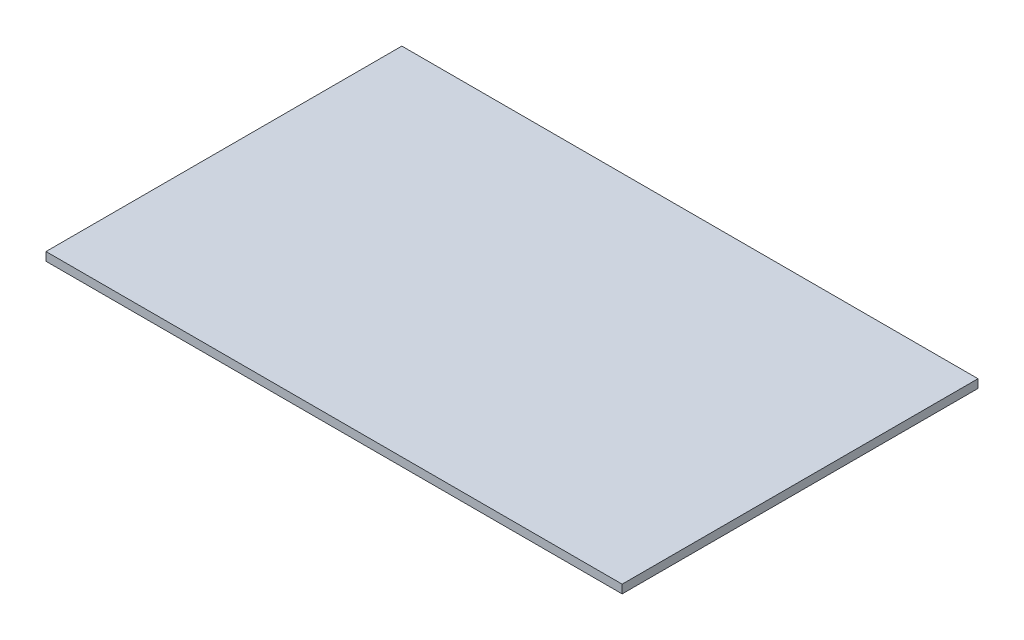
ISO-10303-21;
HEADER;
FILE_DESCRIPTION(('STEP AP214'),'2;1');
FILE_NAME('part.step','',(''),(''),'','','');
FILE_SCHEMA(('AUTOMOTIVE_DESIGN { 1 0 10303 214 1 1 1 1 }'));
ENDSEC;
DATA;
#1=APPLICATION_CONTEXT('core data for automotive mechanical design processes');
#2=APPLICATION_PROTOCOL_DEFINITION('international standard','automotive_design',2000,#1);
#3=PRODUCT_CONTEXT('',#1,'mechanical');
#4=PRODUCT('Part','Part','',(#3));
#5=PRODUCT_RELATED_PRODUCT_CATEGORY('part','',(#4));
#6=PRODUCT_DEFINITION_FORMATION('','',#4);
#7=PRODUCT_DEFINITION_CONTEXT('part definition',#1,'design');
#8=PRODUCT_DEFINITION('design','',#6,#7);
#9=PRODUCT_DEFINITION_SHAPE('','',#8);
#10=(LENGTH_UNIT() NAMED_UNIT(*) SI_UNIT(.MILLI.,.METRE.));
#11=(NAMED_UNIT(*) PLANE_ANGLE_UNIT() SI_UNIT($,.RADIAN.));
#12=(NAMED_UNIT(*) SI_UNIT($,.STERADIAN.) SOLID_ANGLE_UNIT());
#13=UNCERTAINTY_MEASURE_WITH_UNIT(LENGTH_MEASURE(1.E-05),#10,'distance_accuracy_value','');
#14=(GEOMETRIC_REPRESENTATION_CONTEXT(3) GLOBAL_UNCERTAINTY_ASSIGNED_CONTEXT((#13)) GLOBAL_UNIT_ASSIGNED_CONTEXT((#10,
#11,#12)) REPRESENTATION_CONTEXT('',''));
#15=CARTESIAN_POINT('',(0.,0.,0.));
#16=DIRECTION('',(0.,0.,1.));
#17=DIRECTION('',(1.,0.,0.));
#18=AXIS2_PLACEMENT_3D('',#15,#16,#17);
#19=CARTESIAN_POINT('',(-15.9359924524772,0.5,7.56959641492669));
#20=DIRECTION('',(1.,0.,0.));
#21=DIRECTION('',(0.,0.,-1.));
#22=AXIS2_PLACEMENT_3D('',#19,#20,#21);
#23=PLANE('',#22);
#24=DIRECTION('',(0.,0.,1.));
#25=VECTOR('',#24,1.);
#26=CARTESIAN_POINT('',(-15.9359924524772,0.,7.56959641492669));
#27=LINE('',#26,#25);
#28=CARTESIAN_POINT('',(-15.9359924524772,0.,-13.4304035850733));
#29=VERTEX_POINT('',#28);
#30=CARTESIAN_POINT('',(-15.9359924524772,0.,7.56959641492669));
#31=VERTEX_POINT('',#30);
#32=EDGE_CURVE('E107',#29,#31,#27,.T.);
#33=ORIENTED_EDGE('',*,*,#32,.T.);
#34=DIRECTION('',(0.,-1.,0.));
#35=VECTOR('',#34,1.);
#36=CARTESIAN_POINT('',(-15.9359924524772,0.5,7.56959641492669));
#37=LINE('',#36,#35);
#38=CARTESIAN_POINT('',(-15.9359924524772,0.5,7.56959641492669));
#39=VERTEX_POINT('',#38);
#40=EDGE_CURVE('E11',#39,#31,#37,.T.);
#41=ORIENTED_EDGE('',*,*,#40,.F.);
#42=DIRECTION('',(0.,0.,1.));
#43=VECTOR('',#42,1.);
#44=CARTESIAN_POINT('',(-15.9359924524772,0.5,7.56959641492669));
#45=LINE('',#44,#43);
#46=CARTESIAN_POINT('',(-15.9359924524772,0.5,-13.4304035850733));
#47=VERTEX_POINT('',#46);
#48=EDGE_CURVE('E91',#47,#39,#45,.T.);
#49=ORIENTED_EDGE('',*,*,#48,.F.);
#50=DIRECTION('',(0.,-1.,0.));
#51=VECTOR('',#50,1.);
#52=CARTESIAN_POINT('',(-15.9359924524772,0.5,-13.4304035850733));
#53=LINE('',#52,#51);
#54=EDGE_CURVE('E103',#47,#29,#53,.T.);
#55=ORIENTED_EDGE('',*,*,#54,.T.);
#56=EDGE_LOOP('',(#33,#41,#49,#55));
#57=FACE_BOUND('',#56,.T.);
#58=ADVANCED_FACE('F39',(#57),#23,.F.);
#59=CARTESIAN_POINT('',(-15.9359924524772,0.5,7.56959641492669));
#60=DIRECTION('',(0.,0.,-1.));
#61=DIRECTION('',(-1.,0.,0.));
#62=AXIS2_PLACEMENT_3D('',#59,#60,#61);
#63=PLANE('',#62);
#64=DIRECTION('',(1.,0.,0.));
#65=VECTOR('',#64,1.);
#66=CARTESIAN_POINT('',(-15.9359924524772,0.,7.56959641492669));
#67=LINE('',#66,#65);
#68=CARTESIAN_POINT('',(18.0640075475228,0.,7.56959641492669));
#69=VERTEX_POINT('',#68);
#70=EDGE_CURVE('E96',#31,#69,#67,.T.);
#71=ORIENTED_EDGE('',*,*,#70,.T.);
#72=DIRECTION('',(0.,-1.,0.));
#73=VECTOR('',#72,1.);
#74=CARTESIAN_POINT('',(18.0640075475228,0.5,7.56959641492669));
#75=LINE('',#74,#73);
#76=CARTESIAN_POINT('',(18.0640075475228,0.5,7.56959641492669));
#77=VERTEX_POINT('',#76);
#78=EDGE_CURVE('E48',#77,#69,#75,.T.);
#79=ORIENTED_EDGE('',*,*,#78,.F.);
#80=DIRECTION('',(1.,0.,0.));
#81=VECTOR('',#80,1.);
#82=CARTESIAN_POINT('',(-15.9359924524772,0.5,7.56959641492669));
#83=LINE('',#82,#81);
#84=EDGE_CURVE('E86',#39,#77,#83,.T.);
#85=ORIENTED_EDGE('',*,*,#84,.F.);
#86=ORIENTED_EDGE('',*,*,#40,.T.);
#87=EDGE_LOOP('',(#71,#79,#85,#86));
#88=FACE_BOUND('',#87,.T.);
#89=ADVANCED_FACE('F95',(#88),#63,.F.);
#90=CARTESIAN_POINT('',(18.0640075475228,0.5,7.56959641492669));
#91=DIRECTION('',(-1.,0.,0.));
#92=DIRECTION('',(0.,0.,1.));
#93=AXIS2_PLACEMENT_3D('',#90,#91,#92);
#94=PLANE('',#93);
#95=DIRECTION('',(0.,0.,-1.));
#96=VECTOR('',#95,1.);
#97=CARTESIAN_POINT('',(18.0640075475228,0.,7.56959641492669));
#98=LINE('',#97,#96);
#99=CARTESIAN_POINT('',(18.0640075475228,0.,-13.4304035850733));
#100=VERTEX_POINT('',#99);
#101=EDGE_CURVE('E73',#69,#100,#98,.T.);
#102=ORIENTED_EDGE('',*,*,#101,.T.);
#103=DIRECTION('',(0.,-1.,0.));
#104=VECTOR('',#103,1.);
#105=CARTESIAN_POINT('',(18.0640075475228,0.5,-13.4304035850733));
#106=LINE('',#105,#104);
#107=CARTESIAN_POINT('',(18.0640075475228,0.5,-13.4304035850733));
#108=VERTEX_POINT('',#107);
#109=EDGE_CURVE('E98',#108,#100,#106,.T.);
#110=ORIENTED_EDGE('',*,*,#109,.F.);
#111=DIRECTION('',(0.,0.,-1.));
#112=VECTOR('',#111,1.);
#113=CARTESIAN_POINT('',(18.0640075475228,0.5,7.56959641492669));
#114=LINE('',#113,#112);
#115=EDGE_CURVE('E89',#77,#108,#114,.T.);
#116=ORIENTED_EDGE('',*,*,#115,.F.);
#117=ORIENTED_EDGE('',*,*,#78,.T.);
#118=EDGE_LOOP('',(#102,#110,#116,#117));
#119=FACE_BOUND('',#118,.T.);
#120=ADVANCED_FACE('F99',(#119),#94,.F.);
#121=CARTESIAN_POINT('',(-15.9359924524772,0.5,-13.4304035850733));
#122=DIRECTION('',(0.,0.,1.));
#123=DIRECTION('',(1.,0.,0.));
#124=AXIS2_PLACEMENT_3D('',#121,#122,#123);
#125=PLANE('',#124);
#126=DIRECTION('',(-1.,0.,0.));
#127=VECTOR('',#126,1.);
#128=CARTESIAN_POINT('',(-15.9359924524772,0.,-13.4304035850733));
#129=LINE('',#128,#127);
#130=EDGE_CURVE('E79',#100,#29,#129,.T.);
#131=ORIENTED_EDGE('',*,*,#130,.T.);
#132=ORIENTED_EDGE('',*,*,#54,.F.);
#133=DIRECTION('',(-1.,0.,0.));
#134=VECTOR('',#133,1.);
#135=CARTESIAN_POINT('',(-15.9359924524772,0.5,-13.4304035850733));
#136=LINE('',#135,#134);
#137=EDGE_CURVE('E56',#108,#47,#136,.T.);
#138=ORIENTED_EDGE('',*,*,#137,.F.);
#139=ORIENTED_EDGE('',*,*,#109,.T.);
#140=EDGE_LOOP('',(#131,#132,#138,#139));
#141=FACE_BOUND('',#140,.T.);
#142=ADVANCED_FACE('F120',(#141),#125,.F.);
#143=CARTESIAN_POINT('',(0.,0.5,0.));
#144=DIRECTION('',(0.,-1.,0.));
#145=DIRECTION('',(0.,0.,-1.));
#146=AXIS2_PLACEMENT_3D('',#143,#144,#145);
#147=PLANE('',#146);
#148=ORIENTED_EDGE('',*,*,#48,.T.);
#149=ORIENTED_EDGE('',*,*,#84,.T.);
#150=ORIENTED_EDGE('',*,*,#115,.T.);
#151=ORIENTED_EDGE('',*,*,#137,.T.);
#152=EDGE_LOOP('',(#148,#149,#150,#151));
#153=FACE_BOUND('',#152,.T.);
#154=ADVANCED_FACE('F87',(#153),#147,.F.);
#155=CARTESIAN_POINT('',(0.,0.,0.));
#156=DIRECTION('',(0.,-1.,0.));
#157=DIRECTION('',(0.,0.,-1.));
#158=AXIS2_PLACEMENT_3D('',#155,#156,#157);
#159=PLANE('',#158);
#160=ORIENTED_EDGE('',*,*,#32,.F.);
#161=ORIENTED_EDGE('',*,*,#130,.F.);
#162=ORIENTED_EDGE('',*,*,#101,.F.);
#163=ORIENTED_EDGE('',*,*,#70,.F.);
#164=EDGE_LOOP('',(#160,#161,#162,#163));
#165=FACE_BOUND('',#164,.T.);
#166=ADVANCED_FACE('F123',(#165),#159,.T.);
#167=CLOSED_SHELL('',(#58,#89,#120,#142,#154,#166));
#168=MANIFOLD_SOLID_BREP('B2',#167);
#169=ADVANCED_BREP_SHAPE_REPRESENTATION('',(#18,#168),#14);
#170=SHAPE_DEFINITION_REPRESENTATION(#9,#169);
ENDSEC;
END-ISO-10303-21;
